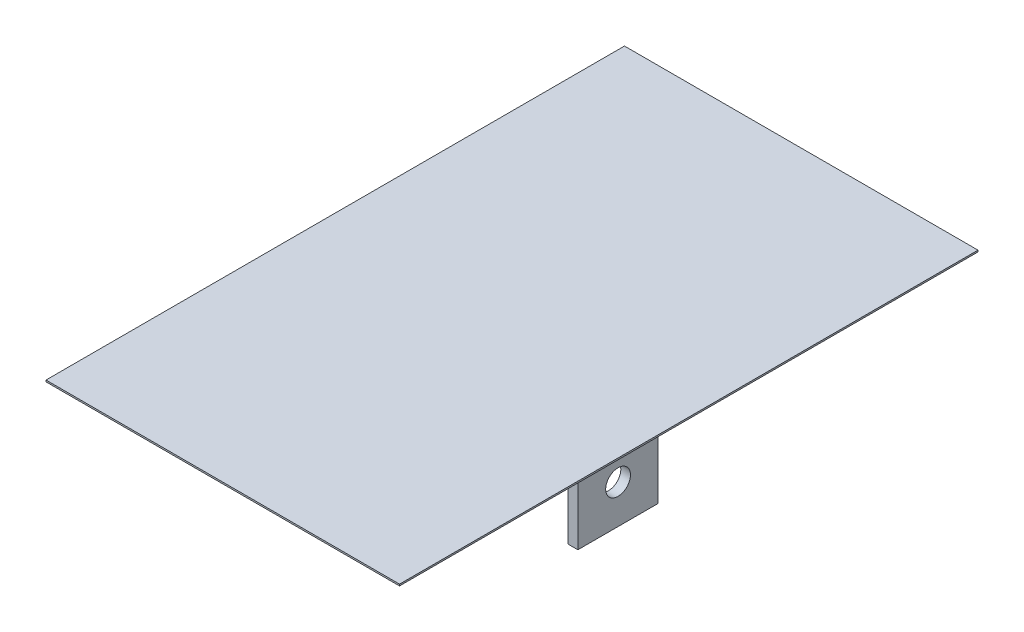
ISO-10303-21;
HEADER;
FILE_DESCRIPTION(('STEP AP214'),'2;1');
FILE_NAME('part.step','',(''),(''),'','','');
FILE_SCHEMA(('AUTOMOTIVE_DESIGN { 1 0 10303 214 1 1 1 1 }'));
ENDSEC;
DATA;
#1=APPLICATION_CONTEXT('core data for automotive mechanical design processes');
#2=APPLICATION_PROTOCOL_DEFINITION('international standard','automotive_design',2000,#1);
#3=PRODUCT_CONTEXT('',#1,'mechanical');
#4=PRODUCT('Part','Part','',(#3));
#5=PRODUCT_RELATED_PRODUCT_CATEGORY('part','',(#4));
#6=PRODUCT_DEFINITION_FORMATION('','',#4);
#7=PRODUCT_DEFINITION_CONTEXT('part definition',#1,'design');
#8=PRODUCT_DEFINITION('design','',#6,#7);
#9=PRODUCT_DEFINITION_SHAPE('','',#8);
#10=(LENGTH_UNIT() NAMED_UNIT(*) SI_UNIT(.MILLI.,.METRE.));
#11=(NAMED_UNIT(*) PLANE_ANGLE_UNIT() SI_UNIT($,.RADIAN.));
#12=(NAMED_UNIT(*) SI_UNIT($,.STERADIAN.) SOLID_ANGLE_UNIT());
#13=UNCERTAINTY_MEASURE_WITH_UNIT(LENGTH_MEASURE(1.E-05),#10,'distance_accuracy_value','');
#14=(GEOMETRIC_REPRESENTATION_CONTEXT(3) GLOBAL_UNCERTAINTY_ASSIGNED_CONTEXT((#13)) GLOBAL_UNIT_ASSIGNED_CONTEXT((#10,
#11,#12)) REPRESENTATION_CONTEXT('',''));
#15=CARTESIAN_POINT('',(0.,0.,0.));
#16=DIRECTION('',(0.,0.,1.));
#17=DIRECTION('',(1.,0.,0.));
#18=AXIS2_PLACEMENT_3D('',#15,#16,#17);
#19=CARTESIAN_POINT('',(0.,0.,0.));
#20=DIRECTION('',(0.,1.,0.));
#21=DIRECTION('',(0.,0.,1.));
#22=AXIS2_PLACEMENT_3D('',#19,#20,#21);
#23=PLANE('',#22);
#24=DIRECTION('',(0.,0.,1.));
#25=VECTOR('',#24,1.);
#26=CARTESIAN_POINT('',(-45.0422516643301,0.,0.));
#27=LINE('',#26,#25);
#28=CARTESIAN_POINT('',(-45.0422516643301,0.,27.6292606681578));
#29=VERTEX_POINT('',#28);
#30=CARTESIAN_POINT('',(-45.0422516643301,0.,52.6292606681578));
#31=VERTEX_POINT('',#30);
#32=EDGE_CURVE('E209',#29,#31,#27,.T.);
#33=ORIENTED_EDGE('',*,*,#32,.F.);
#34=DIRECTION('',(1.,0.,0.));
#35=VECTOR('',#34,1.);
#36=CARTESIAN_POINT('',(0.,0.,27.6292606681578));
#37=LINE('',#36,#35);
#38=CARTESIAN_POINT('',(-48.0422516643301,0.,27.6292606681578));
#39=VERTEX_POINT('',#38);
#40=EDGE_CURVE('E159',#39,#29,#37,.T.);
#41=ORIENTED_EDGE('',*,*,#40,.F.);
#42=DIRECTION('',(0.,0.,1.));
#43=VECTOR('',#42,1.);
#44=CARTESIAN_POINT('',(-48.0422516643301,0.,0.));
#45=LINE('',#44,#43);
#46=CARTESIAN_POINT('',(-48.0422516643301,0.,52.6292606681578));
#47=VERTEX_POINT('',#46);
#48=EDGE_CURVE('E224',#39,#47,#45,.T.);
#49=ORIENTED_EDGE('',*,*,#48,.T.);
#50=DIRECTION('',(1.,0.,0.));
#51=VECTOR('',#50,1.);
#52=CARTESIAN_POINT('',(0.,0.,52.6292606681578));
#53=LINE('',#52,#51);
#54=EDGE_CURVE('E227',#47,#31,#53,.T.);
#55=ORIENTED_EDGE('',*,*,#54,.T.);
#56=EDGE_LOOP('',(#33,#41,#49,#55));
#57=FACE_BOUND('',#56,.T.);
#58=DIRECTION('',(0.,0.,1.));
#59=VECTOR('',#58,1.);
#60=CARTESIAN_POINT('',(-23.0422516643301,0.,0.));
#61=LINE('',#60,#59);
#62=CARTESIAN_POINT('',(-23.0422516643301,0.,-49.8707393318422));
#63=VERTEX_POINT('',#62);
#64=CARTESIAN_POINT('',(-23.0422516643301,0.,130.129260668158));
#65=VERTEX_POINT('',#64);
#66=EDGE_CURVE('E237',#63,#65,#61,.T.);
#67=ORIENTED_EDGE('',*,*,#66,.T.);
#68=DIRECTION('',(1.,0.,0.));
#69=VECTOR('',#68,1.);
#70=CARTESIAN_POINT('',(0.,0.,130.129260668158));
#71=LINE('',#70,#69);
#72=CARTESIAN_POINT('',(-133.04225166433,0.,130.129260668158));
#73=VERTEX_POINT('',#72);
#74=EDGE_CURVE('E254',#73,#65,#71,.T.);
#75=ORIENTED_EDGE('',*,*,#74,.F.);
#76=DIRECTION('',(0.,0.,1.));
#77=VECTOR('',#76,1.);
#78=CARTESIAN_POINT('',(-133.04225166433,0.,0.));
#79=LINE('',#78,#77);
#80=CARTESIAN_POINT('',(-133.04225166433,0.,-49.8707393318422));
#81=VERTEX_POINT('',#80);
#82=EDGE_CURVE('E272',#81,#73,#79,.T.);
#83=ORIENTED_EDGE('',*,*,#82,.F.);
#84=DIRECTION('',(1.,0.,0.));
#85=VECTOR('',#84,1.);
#86=CARTESIAN_POINT('',(0.,0.,-49.8707393318422));
#87=LINE('',#86,#85);
#88=EDGE_CURVE('E268',#81,#63,#87,.T.);
#89=ORIENTED_EDGE('',*,*,#88,.T.);
#90=EDGE_LOOP('',(#67,#75,#83,#89));
#91=FACE_BOUND('',#90,.T.);
#92=DIRECTION('',(-1.,0.,0.));
#93=VECTOR('',#92,1.);
#94=CARTESIAN_POINT('',(0.,0.,52.6292606681578));
#95=LINE('',#94,#93);
#96=CARTESIAN_POINT('',(-108.04225166433,0.,52.6292606681578));
#97=VERTEX_POINT('',#96);
#98=CARTESIAN_POINT('',(-111.04225166433,0.,52.6292606681578));
#99=VERTEX_POINT('',#98);
#100=EDGE_CURVE('E151',#97,#99,#95,.T.);
#101=ORIENTED_EDGE('',*,*,#100,.F.);
#102=DIRECTION('',(0.,0.,1.));
#103=VECTOR('',#102,1.);
#104=CARTESIAN_POINT('',(-108.04225166433,0.,0.));
#105=LINE('',#104,#103);
#106=CARTESIAN_POINT('',(-108.04225166433,0.,27.6292606681578));
#107=VERTEX_POINT('',#106);
#108=EDGE_CURVE('E153',#107,#97,#105,.T.);
#109=ORIENTED_EDGE('',*,*,#108,.F.);
#110=DIRECTION('',(-1.,0.,0.));
#111=VECTOR('',#110,1.);
#112=CARTESIAN_POINT('',(0.,0.,27.6292606681578));
#113=LINE('',#112,#111);
#114=CARTESIAN_POINT('',(-111.04225166433,0.,27.6292606681578));
#115=VERTEX_POINT('',#114);
#116=EDGE_CURVE('E86',#107,#115,#113,.T.);
#117=ORIENTED_EDGE('',*,*,#116,.T.);
#118=DIRECTION('',(0.,0.,1.));
#119=VECTOR('',#118,1.);
#120=CARTESIAN_POINT('',(-111.04225166433,0.,0.));
#121=LINE('',#120,#119);
#122=EDGE_CURVE('E81',#115,#99,#121,.T.);
#123=ORIENTED_EDGE('',*,*,#122,.T.);
#124=EDGE_LOOP('',(#101,#109,#117,#123));
#125=FACE_BOUND('',#124,.T.);
#126=ADVANCED_FACE('F65',(#57,#91,#125),#23,.F.);
#127=CARTESIAN_POINT('',(-23.0422516643301,0.5,0.));
#128=DIRECTION('',(1.,0.,0.));
#129=DIRECTION('',(0.,0.,-1.));
#130=AXIS2_PLACEMENT_3D('',#127,#128,#129);
#131=PLANE('',#130);
#132=ORIENTED_EDGE('',*,*,#66,.F.);
#133=DIRECTION('',(0.,-1.,0.));
#134=VECTOR('',#133,1.);
#135=CARTESIAN_POINT('',(-23.0422516643301,0.5,-49.8707393318422));
#136=LINE('',#135,#134);
#137=CARTESIAN_POINT('',(-23.0422516643301,0.5,-49.8707393318422));
#138=VERTEX_POINT('',#137);
#139=EDGE_CURVE('E12',#138,#63,#136,.T.);
#140=ORIENTED_EDGE('',*,*,#139,.F.);
#141=DIRECTION('',(0.,0.,1.));
#142=VECTOR('',#141,1.);
#143=CARTESIAN_POINT('',(-23.0422516643301,0.5,0.));
#144=LINE('',#143,#142);
#145=CARTESIAN_POINT('',(-23.0422516643301,0.5,130.129260668158));
#146=VERTEX_POINT('',#145);
#147=EDGE_CURVE('E249',#138,#146,#144,.T.);
#148=ORIENTED_EDGE('',*,*,#147,.T.);
#149=DIRECTION('',(0.,-1.,0.));
#150=VECTOR('',#149,1.);
#151=CARTESIAN_POINT('',(-23.0422516643301,0.5,130.129260668158));
#152=LINE('',#151,#150);
#153=EDGE_CURVE('E264',#146,#65,#152,.T.);
#154=ORIENTED_EDGE('',*,*,#153,.T.);
#155=EDGE_LOOP('',(#132,#140,#148,#154));
#156=FACE_BOUND('',#155,.T.);
#157=ADVANCED_FACE('F67',(#156),#131,.T.);
#158=CARTESIAN_POINT('',(0.,0.5,-49.8707393318422));
#159=DIRECTION('',(0.,0.,-1.));
#160=DIRECTION('',(-1.,0.,0.));
#161=AXIS2_PLACEMENT_3D('',#158,#159,#160);
#162=PLANE('',#161);
#163=ORIENTED_EDGE('',*,*,#88,.F.);
#164=DIRECTION('',(0.,-1.,0.));
#165=VECTOR('',#164,1.);
#166=CARTESIAN_POINT('',(-133.04225166433,0.5,-49.8707393318422));
#167=LINE('',#166,#165);
#168=CARTESIAN_POINT('',(-133.04225166433,0.5,-49.8707393318422));
#169=VERTEX_POINT('',#168);
#170=EDGE_CURVE('E74',#169,#81,#167,.T.);
#171=ORIENTED_EDGE('',*,*,#170,.F.);
#172=DIRECTION('',(1.,0.,0.));
#173=VECTOR('',#172,1.);
#174=CARTESIAN_POINT('',(0.,0.5,-49.8707393318422));
#175=LINE('',#174,#173);
#176=EDGE_CURVE('E253',#169,#138,#175,.T.);
#177=ORIENTED_EDGE('',*,*,#176,.T.);
#178=ORIENTED_EDGE('',*,*,#139,.T.);
#179=EDGE_LOOP('',(#163,#171,#177,#178));
#180=FACE_BOUND('',#179,.T.);
#181=ADVANCED_FACE('F294',(#180),#162,.T.);
#182=CARTESIAN_POINT('',(-133.04225166433,0.5,0.));
#183=DIRECTION('',(1.,0.,0.));
#184=DIRECTION('',(0.,0.,-1.));
#185=AXIS2_PLACEMENT_3D('',#182,#183,#184);
#186=PLANE('',#185);
#187=ORIENTED_EDGE('',*,*,#82,.T.);
#188=DIRECTION('',(0.,-1.,0.));
#189=VECTOR('',#188,1.);
#190=CARTESIAN_POINT('',(-133.04225166433,0.5,130.129260668158));
#191=LINE('',#190,#189);
#192=CARTESIAN_POINT('',(-133.04225166433,0.5,130.129260668158));
#193=VERTEX_POINT('',#192);
#194=EDGE_CURVE('E280',#193,#73,#191,.T.);
#195=ORIENTED_EDGE('',*,*,#194,.F.);
#196=DIRECTION('',(0.,0.,1.));
#197=VECTOR('',#196,1.);
#198=CARTESIAN_POINT('',(-133.04225166433,0.5,0.));
#199=LINE('',#198,#197);
#200=EDGE_CURVE('E258',#169,#193,#199,.T.);
#201=ORIENTED_EDGE('',*,*,#200,.F.);
#202=ORIENTED_EDGE('',*,*,#170,.T.);
#203=EDGE_LOOP('',(#187,#195,#201,#202));
#204=FACE_BOUND('',#203,.T.);
#205=ADVANCED_FACE('F287',(#204),#186,.F.);
#206=CARTESIAN_POINT('',(0.,0.5,130.129260668158));
#207=DIRECTION('',(0.,0.,-1.));
#208=DIRECTION('',(-1.,0.,0.));
#209=AXIS2_PLACEMENT_3D('',#206,#207,#208);
#210=PLANE('',#209);
#211=ORIENTED_EDGE('',*,*,#74,.T.);
#212=ORIENTED_EDGE('',*,*,#153,.F.);
#213=DIRECTION('',(1.,0.,0.));
#214=VECTOR('',#213,1.);
#215=CARTESIAN_POINT('',(0.,0.5,130.129260668158));
#216=LINE('',#215,#214);
#217=EDGE_CURVE('E261',#193,#146,#216,.T.);
#218=ORIENTED_EDGE('',*,*,#217,.F.);
#219=ORIENTED_EDGE('',*,*,#194,.T.);
#220=EDGE_LOOP('',(#211,#212,#218,#219));
#221=FACE_BOUND('',#220,.T.);
#222=ADVANCED_FACE('F301',(#221),#210,.F.);
#223=CARTESIAN_POINT('',(0.,0.5,0.));
#224=DIRECTION('',(0.,1.,0.));
#225=DIRECTION('',(0.,0.,1.));
#226=AXIS2_PLACEMENT_3D('',#223,#224,#225);
#227=PLANE('',#226);
#228=ORIENTED_EDGE('',*,*,#147,.F.);
#229=ORIENTED_EDGE('',*,*,#176,.F.);
#230=ORIENTED_EDGE('',*,*,#200,.T.);
#231=ORIENTED_EDGE('',*,*,#217,.T.);
#232=EDGE_LOOP('',(#228,#229,#230,#231));
#233=FACE_BOUND('',#232,.T.);
#234=ADVANCED_FACE('F303',(#233),#227,.T.);
#235=CARTESIAN_POINT('',(-45.0422516643301,-40.,0.));
#236=DIRECTION('',(-1.,0.,0.));
#237=DIRECTION('',(0.,0.,1.));
#238=AXIS2_PLACEMENT_3D('',#235,#236,#237);
#239=PLANE('',#238);
#240=CARTESIAN_POINT('',(-45.0422516643301,-28.,40.1292606681578));
#241=DIRECTION('',(-1.,0.,0.));
#242=DIRECTION('',(0.,0.,1.));
#243=AXIS2_PLACEMENT_3D('',#240,#241,#242);
#244=CIRCLE('',#243,3.85);
#245=CARTESIAN_POINT('',(-45.0422516643301,-28.,43.9792606681578));
#246=VERTEX_POINT('',#245);
#247=EDGE_CURVE('E483',#246,#246,#244,.T.);
#248=ORIENTED_EDGE('',*,*,#247,.T.);
#249=EDGE_LOOP('',(#248));
#250=FACE_BOUND('',#249,.T.);
#251=ORIENTED_EDGE('',*,*,#32,.T.);
#252=DIRECTION('',(0.,1.,0.));
#253=VECTOR('',#252,1.);
#254=CARTESIAN_POINT('',(-45.0422516643301,-40.,52.6292606681578));
#255=LINE('',#254,#253);
#256=CARTESIAN_POINT('',(-45.0422516643301,-40.,52.6292606681578));
#257=VERTEX_POINT('',#256);
#258=EDGE_CURVE('E238',#257,#31,#255,.T.);
#259=ORIENTED_EDGE('',*,*,#258,.F.);
#260=DIRECTION('',(0.,0.,1.));
#261=VECTOR('',#260,1.);
#262=CARTESIAN_POINT('',(-45.0422516643301,-40.,0.));
#263=LINE('',#262,#261);
#264=CARTESIAN_POINT('',(-45.0422516643301,-40.,27.6292606681578));
#265=VERTEX_POINT('',#264);
#266=EDGE_CURVE('E217',#265,#257,#263,.T.);
#267=ORIENTED_EDGE('',*,*,#266,.F.);
#268=DIRECTION('',(0.,1.,0.));
#269=VECTOR('',#268,1.);
#270=CARTESIAN_POINT('',(-45.0422516643301,-40.,27.6292606681578));
#271=LINE('',#270,#269);
#272=EDGE_CURVE('E233',#265,#29,#271,.T.);
#273=ORIENTED_EDGE('',*,*,#272,.T.);
#274=EDGE_LOOP('',(#251,#259,#267,#273));
#275=FACE_BOUND('',#274,.T.);
#276=ADVANCED_FACE('F305',(#250,#275),#239,.F.);
#277=CARTESIAN_POINT('',(0.,-40.,52.6292606681578));
#278=DIRECTION('',(0.,0.,1.));
#279=DIRECTION('',(1.,0.,0.));
#280=AXIS2_PLACEMENT_3D('',#277,#278,#279);
#281=PLANE('',#280);
#282=ORIENTED_EDGE('',*,*,#54,.F.);
#283=DIRECTION('',(0.,1.,0.));
#284=VECTOR('',#283,1.);
#285=CARTESIAN_POINT('',(-48.0422516643301,-40.,52.6292606681578));
#286=LINE('',#285,#284);
#287=CARTESIAN_POINT('',(-48.0422516643301,-40.,52.6292606681578));
#288=VERTEX_POINT('',#287);
#289=EDGE_CURVE('E242',#288,#47,#286,.T.);
#290=ORIENTED_EDGE('',*,*,#289,.F.);
#291=DIRECTION('',(1.,0.,0.));
#292=VECTOR('',#291,1.);
#293=CARTESIAN_POINT('',(0.,-40.,52.6292606681578));
#294=LINE('',#293,#292);
#295=EDGE_CURVE('E213',#288,#257,#294,.T.);
#296=ORIENTED_EDGE('',*,*,#295,.T.);
#297=ORIENTED_EDGE('',*,*,#258,.T.);
#298=EDGE_LOOP('',(#282,#290,#296,#297));
#299=FACE_BOUND('',#298,.T.);
#300=ADVANCED_FACE('F311',(#299),#281,.T.);
#301=CARTESIAN_POINT('',(-48.0422516643301,-40.,0.));
#302=DIRECTION('',(-1.,0.,0.));
#303=DIRECTION('',(0.,0.,1.));
#304=AXIS2_PLACEMENT_3D('',#301,#302,#303);
#305=PLANE('',#304);
#306=CARTESIAN_POINT('',(-48.0422516643301,-28.,40.1292606681578));
#307=DIRECTION('',(-1.,0.,0.));
#308=DIRECTION('',(0.,0.,1.));
#309=AXIS2_PLACEMENT_3D('',#306,#307,#308);
#310=CIRCLE('',#309,3.85);
#311=CARTESIAN_POINT('',(-48.0422516643301,-28.,43.9792606681578));
#312=VERTEX_POINT('',#311);
#313=EDGE_CURVE('E480',#312,#312,#310,.T.);
#314=ORIENTED_EDGE('',*,*,#313,.F.);
#315=EDGE_LOOP('',(#314));
#316=FACE_BOUND('',#315,.T.);
#317=ORIENTED_EDGE('',*,*,#48,.F.);
#318=DIRECTION('',(0.,1.,0.));
#319=VECTOR('',#318,1.);
#320=CARTESIAN_POINT('',(-48.0422516643301,-40.,27.6292606681578));
#321=LINE('',#320,#319);
#322=CARTESIAN_POINT('',(-48.0422516643301,-40.,27.6292606681578));
#323=VERTEX_POINT('',#322);
#324=EDGE_CURVE('E220',#323,#39,#321,.T.);
#325=ORIENTED_EDGE('',*,*,#324,.F.);
#326=DIRECTION('',(0.,0.,1.));
#327=VECTOR('',#326,1.);
#328=CARTESIAN_POINT('',(-48.0422516643301,-40.,0.));
#329=LINE('',#328,#327);
#330=EDGE_CURVE('E208',#323,#288,#329,.T.);
#331=ORIENTED_EDGE('',*,*,#330,.T.);
#332=ORIENTED_EDGE('',*,*,#289,.T.);
#333=EDGE_LOOP('',(#317,#325,#331,#332));
#334=FACE_BOUND('',#333,.T.);
#335=ADVANCED_FACE('F357',(#316,#334),#305,.T.);
#336=CARTESIAN_POINT('',(0.,-40.,27.6292606681578));
#337=DIRECTION('',(0.,0.,1.));
#338=DIRECTION('',(1.,0.,0.));
#339=AXIS2_PLACEMENT_3D('',#336,#337,#338);
#340=PLANE('',#339);
#341=ORIENTED_EDGE('',*,*,#40,.T.);
#342=ORIENTED_EDGE('',*,*,#272,.F.);
#343=DIRECTION('',(1.,0.,0.));
#344=VECTOR('',#343,1.);
#345=CARTESIAN_POINT('',(0.,-40.,27.6292606681578));
#346=LINE('',#345,#344);
#347=EDGE_CURVE('E204',#323,#265,#346,.T.);
#348=ORIENTED_EDGE('',*,*,#347,.F.);
#349=ORIENTED_EDGE('',*,*,#324,.T.);
#350=EDGE_LOOP('',(#341,#342,#348,#349));
#351=FACE_BOUND('',#350,.T.);
#352=ADVANCED_FACE('F366',(#351),#340,.F.);
#353=CARTESIAN_POINT('',(0.,-40.,0.));
#354=DIRECTION('',(0.,1.,0.));
#355=DIRECTION('',(0.,0.,1.));
#356=AXIS2_PLACEMENT_3D('',#353,#354,#355);
#357=PLANE('',#356);
#358=ORIENTED_EDGE('',*,*,#347,.T.);
#359=ORIENTED_EDGE('',*,*,#266,.T.);
#360=ORIENTED_EDGE('',*,*,#295,.F.);
#361=ORIENTED_EDGE('',*,*,#330,.F.);
#362=EDGE_LOOP('',(#358,#359,#360,#361));
#363=FACE_BOUND('',#362,.T.);
#364=ADVANCED_FACE('F371',(#363),#357,.F.);
#365=CARTESIAN_POINT('',(0.,-40.,52.6292606681578));
#366=DIRECTION('',(0.,0.,-1.));
#367=DIRECTION('',(-1.,0.,0.));
#368=AXIS2_PLACEMENT_3D('',#365,#366,#367);
#369=PLANE('',#368);
#370=ORIENTED_EDGE('',*,*,#100,.T.);
#371=DIRECTION('',(0.,1.,0.));
#372=VECTOR('',#371,1.);
#373=CARTESIAN_POINT('',(-111.04225166433,-40.,52.6292606681578));
#374=LINE('',#373,#372);
#375=CARTESIAN_POINT('',(-111.04225166433,-40.,52.6292606681578));
#376=VERTEX_POINT('',#375);
#377=EDGE_CURVE('E188',#376,#99,#374,.T.);
#378=ORIENTED_EDGE('',*,*,#377,.F.);
#379=DIRECTION('',(-1.,0.,0.));
#380=VECTOR('',#379,1.);
#381=CARTESIAN_POINT('',(0.,-40.,52.6292606681578));
#382=LINE('',#381,#380);
#383=CARTESIAN_POINT('',(-108.04225166433,-40.,52.6292606681578));
#384=VERTEX_POINT('',#383);
#385=EDGE_CURVE('E171',#384,#376,#382,.T.);
#386=ORIENTED_EDGE('',*,*,#385,.F.);
#387=DIRECTION('',(0.,1.,0.));
#388=VECTOR('',#387,1.);
#389=CARTESIAN_POINT('',(-108.04225166433,-40.,52.6292606681578));
#390=LINE('',#389,#388);
#391=EDGE_CURVE('E165',#384,#97,#390,.T.);
#392=ORIENTED_EDGE('',*,*,#391,.T.);
#393=EDGE_LOOP('',(#370,#378,#386,#392));
#394=FACE_BOUND('',#393,.T.);
#395=ADVANCED_FACE('F170',(#394),#369,.F.);
#396=CARTESIAN_POINT('',(-111.04225166433,-40.,0.));
#397=DIRECTION('',(-1.,0.,0.));
#398=DIRECTION('',(0.,0.,1.));
#399=AXIS2_PLACEMENT_3D('',#396,#397,#398);
#400=PLANE('',#399);
#401=ORIENTED_EDGE('',*,*,#122,.F.);
#402=DIRECTION('',(0.,1.,0.));
#403=VECTOR('',#402,1.);
#404=CARTESIAN_POINT('',(-111.04225166433,-40.,27.6292606681578));
#405=LINE('',#404,#403);
#406=CARTESIAN_POINT('',(-111.04225166433,-40.,27.6292606681578));
#407=VERTEX_POINT('',#406);
#408=EDGE_CURVE('E180',#407,#115,#405,.T.);
#409=ORIENTED_EDGE('',*,*,#408,.F.);
#410=DIRECTION('',(0.,0.,1.));
#411=VECTOR('',#410,1.);
#412=CARTESIAN_POINT('',(-111.04225166433,-40.,0.));
#413=LINE('',#412,#411);
#414=EDGE_CURVE('E173',#407,#376,#413,.T.);
#415=ORIENTED_EDGE('',*,*,#414,.T.);
#416=ORIENTED_EDGE('',*,*,#377,.T.);
#417=EDGE_LOOP('',(#401,#409,#415,#416));
#418=FACE_BOUND('',#417,.T.);
#419=ADVANCED_FACE('F391',(#418),#400,.T.);
#420=CARTESIAN_POINT('',(0.,-40.,27.6292606681578));
#421=DIRECTION('',(0.,0.,-1.));
#422=DIRECTION('',(-1.,0.,0.));
#423=AXIS2_PLACEMENT_3D('',#420,#421,#422);
#424=PLANE('',#423);
#425=ORIENTED_EDGE('',*,*,#116,.F.);
#426=DIRECTION('',(0.,1.,0.));
#427=VECTOR('',#426,1.);
#428=CARTESIAN_POINT('',(-108.04225166433,-40.,27.6292606681578));
#429=LINE('',#428,#427);
#430=CARTESIAN_POINT('',(-108.04225166433,-40.,27.6292606681578));
#431=VERTEX_POINT('',#430);
#432=EDGE_CURVE('E167',#431,#107,#429,.T.);
#433=ORIENTED_EDGE('',*,*,#432,.F.);
#434=DIRECTION('',(-1.,0.,0.));
#435=VECTOR('',#434,1.);
#436=CARTESIAN_POINT('',(0.,-40.,27.6292606681578));
#437=LINE('',#436,#435);
#438=EDGE_CURVE('E178',#431,#407,#437,.T.);
#439=ORIENTED_EDGE('',*,*,#438,.T.);
#440=ORIENTED_EDGE('',*,*,#408,.T.);
#441=EDGE_LOOP('',(#425,#433,#439,#440));
#442=FACE_BOUND('',#441,.T.);
#443=ADVANCED_FACE('F400',(#442),#424,.T.);
#444=CARTESIAN_POINT('',(-108.04225166433,-40.,0.));
#445=DIRECTION('',(-1.,0.,0.));
#446=DIRECTION('',(0.,0.,1.));
#447=AXIS2_PLACEMENT_3D('',#444,#445,#446);
#448=PLANE('',#447);
#449=CARTESIAN_POINT('',(-108.04225166433,-28.,40.1292606681578));
#450=DIRECTION('',(1.,0.,0.));
#451=DIRECTION('',(0.,0.,-1.));
#452=AXIS2_PLACEMENT_3D('',#449,#450,#451);
#453=CIRCLE('',#452,10.6);
#454=CARTESIAN_POINT('',(-108.04225166433,-28.,29.5292606681578));
#455=VERTEX_POINT('',#454);
#456=EDGE_CURVE('E183',#455,#455,#453,.T.);
#457=ORIENTED_EDGE('',*,*,#456,.F.);
#458=EDGE_LOOP('',(#457));
#459=FACE_BOUND('',#458,.T.);
#460=ORIENTED_EDGE('',*,*,#108,.T.);
#461=ORIENTED_EDGE('',*,*,#391,.F.);
#462=DIRECTION('',(0.,0.,1.));
#463=VECTOR('',#462,1.);
#464=CARTESIAN_POINT('',(-108.04225166433,-40.,0.));
#465=LINE('',#464,#463);
#466=EDGE_CURVE('E199',#431,#384,#465,.T.);
#467=ORIENTED_EDGE('',*,*,#466,.F.);
#468=ORIENTED_EDGE('',*,*,#432,.T.);
#469=EDGE_LOOP('',(#460,#461,#467,#468));
#470=FACE_BOUND('',#469,.T.);
#471=ADVANCED_FACE('F163',(#459,#470),#448,.F.);
#472=CARTESIAN_POINT('',(0.,-40.,0.));
#473=DIRECTION('',(0.,1.,0.));
#474=DIRECTION('',(0.,0.,1.));
#475=AXIS2_PLACEMENT_3D('',#472,#473,#474);
#476=PLANE('',#475);
#477=ORIENTED_EDGE('',*,*,#385,.T.);
#478=ORIENTED_EDGE('',*,*,#414,.F.);
#479=ORIENTED_EDGE('',*,*,#438,.F.);
#480=ORIENTED_EDGE('',*,*,#466,.T.);
#481=EDGE_LOOP('',(#477,#478,#479,#480));
#482=FACE_BOUND('',#481,.T.);
#483=ADVANCED_FACE('F417',(#482),#476,.F.);
#484=CARTESIAN_POINT('',(-109.04225166433,-28.,40.1292606681578));
#485=DIRECTION('',(1.,0.,0.));
#486=DIRECTION('',(0.,0.,-1.));
#487=AXIS2_PLACEMENT_3D('',#484,#485,#486);
#488=CYLINDRICAL_SURFACE('',#487,10.6);
#489=CARTESIAN_POINT('',(-109.04225166433,-28.,40.1292606681578));
#490=DIRECTION('',(1.,0.,0.));
#491=DIRECTION('',(0.,0.,-1.));
#492=AXIS2_PLACEMENT_3D('',#489,#490,#491);
#493=CIRCLE('',#492,10.6);
#494=CARTESIAN_POINT('',(-109.04225166433,-28.,29.5292606681578));
#495=VERTEX_POINT('',#494);
#496=EDGE_CURVE('E191',#495,#495,#493,.T.);
#497=ORIENTED_EDGE('',*,*,#496,.F.);
#498=EDGE_LOOP('',(#497));
#499=FACE_BOUND('',#498,.T.);
#500=ORIENTED_EDGE('',*,*,#456,.T.);
#501=EDGE_LOOP('',(#500));
#502=FACE_BOUND('',#501,.T.);
#503=ADVANCED_FACE('F422',(#499,#502),#488,.F.);
#504=CARTESIAN_POINT('',(-109.04225166433,-28.,40.1292606681578));
#505=DIRECTION('',(1.,0.,0.));
#506=DIRECTION('',(0.,0.,-1.));
#507=AXIS2_PLACEMENT_3D('',#504,#505,#506);
#508=PLANE('',#507);
#509=ORIENTED_EDGE('',*,*,#496,.T.);
#510=EDGE_LOOP('',(#509));
#511=FACE_BOUND('',#510,.T.);
#512=ADVANCED_FACE('F439',(#511),#508,.T.);
#513=CARTESIAN_POINT('',(-23.0422516643301,-28.,40.1292606681578));
#514=DIRECTION('',(-1.,0.,0.));
#515=DIRECTION('',(0.,0.,1.));
#516=AXIS2_PLACEMENT_3D('',#513,#514,#515);
#517=CYLINDRICAL_SURFACE('',#516,3.85);
#518=ORIENTED_EDGE('',*,*,#313,.T.);
#519=EDGE_LOOP('',(#518));
#520=FACE_BOUND('',#519,.T.);
#521=ORIENTED_EDGE('',*,*,#247,.F.);
#522=EDGE_LOOP('',(#521));
#523=FACE_BOUND('',#522,.T.);
#524=ADVANCED_FACE('F449',(#520,#523),#517,.F.);
#525=CLOSED_SHELL('',(#126,#157,#181,#205,#222,#234,#276,#300,#335,#352,#364,#395,#419,#443,
#471,#483,#503,#512,#524));
#526=MANIFOLD_SOLID_BREP('B2',#525);
#527=ADVANCED_BREP_SHAPE_REPRESENTATION('',(#18,#526),#14);
#528=SHAPE_DEFINITION_REPRESENTATION(#9,#527);
ENDSEC;
END-ISO-10303-21;
